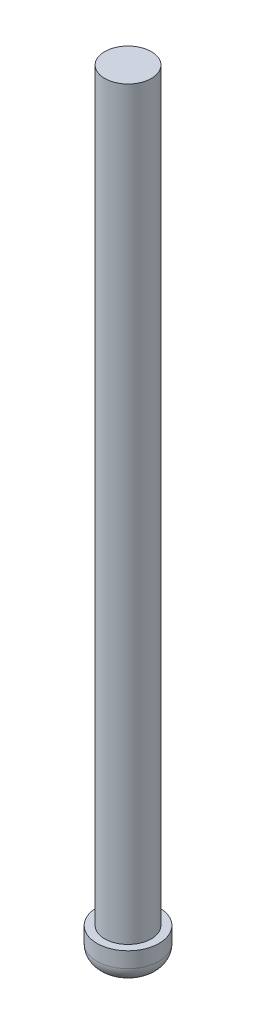
ISO-10303-21;
HEADER;
FILE_DESCRIPTION(('STEP AP214'),'2;1');
FILE_NAME('part.step','',(''),(''),'','','');
FILE_SCHEMA(('AUTOMOTIVE_DESIGN { 1 0 10303 214 1 1 1 1 }'));
ENDSEC;
DATA;
#1=APPLICATION_CONTEXT('core data for automotive mechanical design processes');
#2=APPLICATION_PROTOCOL_DEFINITION('international standard','automotive_design',2000,#1);
#3=PRODUCT_CONTEXT('',#1,'mechanical');
#4=PRODUCT('Part','Part','',(#3));
#5=PRODUCT_RELATED_PRODUCT_CATEGORY('part','',(#4));
#6=PRODUCT_DEFINITION_FORMATION('','',#4);
#7=PRODUCT_DEFINITION_CONTEXT('part definition',#1,'design');
#8=PRODUCT_DEFINITION('design','',#6,#7);
#9=PRODUCT_DEFINITION_SHAPE('','',#8);
#10=(LENGTH_UNIT() NAMED_UNIT(*) SI_UNIT(.MILLI.,.METRE.));
#11=(NAMED_UNIT(*) PLANE_ANGLE_UNIT() SI_UNIT($,.RADIAN.));
#12=(NAMED_UNIT(*) SI_UNIT($,.STERADIAN.) SOLID_ANGLE_UNIT());
#13=UNCERTAINTY_MEASURE_WITH_UNIT(LENGTH_MEASURE(1.E-05),#10,'distance_accuracy_value','');
#14=(GEOMETRIC_REPRESENTATION_CONTEXT(3) GLOBAL_UNCERTAINTY_ASSIGNED_CONTEXT((#13)) GLOBAL_UNIT_ASSIGNED_CONTEXT((#10,
#11,#12)) REPRESENTATION_CONTEXT('',''));
#15=CARTESIAN_POINT('',(0.,0.,0.));
#16=DIRECTION('',(0.,0.,1.));
#17=DIRECTION('',(1.,0.,0.));
#18=AXIS2_PLACEMENT_3D('',#15,#16,#17);
#19=CARTESIAN_POINT('',(0.,24.,0.));
#20=DIRECTION('',(0.,-1.,0.));
#21=DIRECTION('',(0.,0.,-1.));
#22=AXIS2_PLACEMENT_3D('',#19,#20,#21);
#23=CYLINDRICAL_SURFACE('',#22,0.750000000000001);
#24=CARTESIAN_POINT('',(0.,24.,0.));
#25=DIRECTION('',(0.,1.,0.));
#26=DIRECTION('',(0.,0.,1.));
#27=AXIS2_PLACEMENT_3D('',#24,#25,#26);
#28=CIRCLE('',#27,0.750000000000001);
#29=CARTESIAN_POINT('',(0.,24.,0.750000000000001));
#30=VERTEX_POINT('',#29);
#31=EDGE_CURVE('E50',#30,#30,#28,.T.);
#32=ORIENTED_EDGE('',*,*,#31,.F.);
#33=EDGE_LOOP('',(#32));
#34=FACE_BOUND('',#33,.T.);
#35=CARTESIAN_POINT('',(0.,0.,0.));
#36=DIRECTION('',(0.,1.,0.));
#37=DIRECTION('',(0.,0.,1.));
#38=AXIS2_PLACEMENT_3D('',#35,#36,#37);
#39=CIRCLE('',#38,0.750000000000001);
#40=CARTESIAN_POINT('',(0.,0.,0.750000000000001));
#41=VERTEX_POINT('',#40);
#42=EDGE_CURVE('E55',#41,#41,#39,.T.);
#43=ORIENTED_EDGE('',*,*,#42,.T.);
#44=EDGE_LOOP('',(#43));
#45=FACE_BOUND('',#44,.T.);
#46=ADVANCED_FACE('F37',(#34,#45),#23,.T.);
#47=CARTESIAN_POINT('',(0.,24.,0.));
#48=DIRECTION('',(0.,1.,0.));
#49=DIRECTION('',(0.,0.,1.));
#50=AXIS2_PLACEMENT_3D('',#47,#48,#49);
#51=PLANE('',#50);
#52=ORIENTED_EDGE('',*,*,#31,.T.);
#53=EDGE_LOOP('',(#52));
#54=FACE_BOUND('',#53,.T.);
#55=ADVANCED_FACE('F82',(#54),#51,.T.);
#56=CARTESIAN_POINT('',(0.,-1.,0.));
#57=DIRECTION('',(0.,1.,0.));
#58=DIRECTION('',(0.,0.,1.));
#59=AXIS2_PLACEMENT_3D('',#56,#57,#58);
#60=CYLINDRICAL_SURFACE('',#59,1.);
#61=CARTESIAN_POINT('',(0.,-0.5,0.));
#62=DIRECTION('',(0.,-1.,0.));
#63=DIRECTION('',(0.,0.,-1.));
#64=AXIS2_PLACEMENT_3D('',#61,#62,#63);
#65=CIRCLE('',#64,1.);
#66=CARTESIAN_POINT('',(0.,-0.5,-1.));
#67=VERTEX_POINT('',#66);
#68=EDGE_CURVE('E10',#67,#67,#65,.F.);
#69=ORIENTED_EDGE('',*,*,#68,.T.);
#70=EDGE_LOOP('',(#69));
#71=FACE_BOUND('',#70,.T.);
#72=CARTESIAN_POINT('',(0.,0.,0.));
#73=DIRECTION('',(0.,-1.,0.));
#74=DIRECTION('',(0.,0.,-1.));
#75=AXIS2_PLACEMENT_3D('',#72,#73,#74);
#76=CIRCLE('',#75,1.);
#77=CARTESIAN_POINT('',(0.,0.,-1.));
#78=VERTEX_POINT('',#77);
#79=EDGE_CURVE('E60',#78,#78,#76,.T.);
#80=ORIENTED_EDGE('',*,*,#79,.T.);
#81=EDGE_LOOP('',(#80));
#82=FACE_BOUND('',#81,.T.);
#83=ADVANCED_FACE('F66',(#71,#82),#60,.T.);
#84=CARTESIAN_POINT('',(0.,-1.,0.));
#85=DIRECTION('',(0.,-1.,0.));
#86=DIRECTION('',(0.,0.,-1.));
#87=AXIS2_PLACEMENT_3D('',#84,#85,#86);
#88=PLANE('',#87);
#89=CARTESIAN_POINT('',(0.,-1.,0.));
#90=DIRECTION('',(0.,-1.,0.));
#91=DIRECTION('',(0.,0.,-1.));
#92=AXIS2_PLACEMENT_3D('',#89,#90,#91);
#93=CIRCLE('',#92,0.5);
#94=CARTESIAN_POINT('',(0.,-1.,-0.5));
#95=VERTEX_POINT('',#94);
#96=EDGE_CURVE('E45',#95,#95,#93,.T.);
#97=ORIENTED_EDGE('',*,*,#96,.T.);
#98=EDGE_LOOP('',(#97));
#99=FACE_BOUND('',#98,.T.);
#100=ADVANCED_FACE('F70',(#99),#88,.T.);
#101=CARTESIAN_POINT('',(0.,0.,0.));
#102=DIRECTION('',(0.,-1.,0.));
#103=DIRECTION('',(0.,0.,-1.));
#104=AXIS2_PLACEMENT_3D('',#101,#102,#103);
#105=PLANE('',#104);
#106=ORIENTED_EDGE('',*,*,#42,.F.);
#107=EDGE_LOOP('',(#106));
#108=FACE_BOUND('',#107,.T.);
#109=ORIENTED_EDGE('',*,*,#79,.F.);
#110=EDGE_LOOP('',(#109));
#111=FACE_BOUND('',#110,.T.);
#112=ADVANCED_FACE('F68',(#108,#111),#105,.F.);
#113=CARTESIAN_POINT('',(0.,-0.5,0.));
#114=DIRECTION('',(0.,-1.,0.));
#115=DIRECTION('',(0.,0.,-1.));
#116=AXIS2_PLACEMENT_3D('',#113,#114,#115);
#117=DEGENERATE_TOROIDAL_SURFACE('',#116,0.5,0.5,.T.);
#118=ORIENTED_EDGE('',*,*,#68,.F.);
#119=EDGE_LOOP('',(#118));
#120=FACE_BOUND('',#119,.T.);
#121=ORIENTED_EDGE('',*,*,#96,.F.);
#122=EDGE_LOOP('',(#121));
#123=FACE_BOUND('',#122,.T.);
#124=ADVANCED_FACE('F39',(#120,#123),#117,.T.);
#125=CLOSED_SHELL('',(#46,#55,#83,#100,#112,#124));
#126=MANIFOLD_SOLID_BREP('B2',#125);
#127=ADVANCED_BREP_SHAPE_REPRESENTATION('',(#18,#126),#14);
#128=SHAPE_DEFINITION_REPRESENTATION(#9,#127);
ENDSEC;
END-ISO-10303-21;
